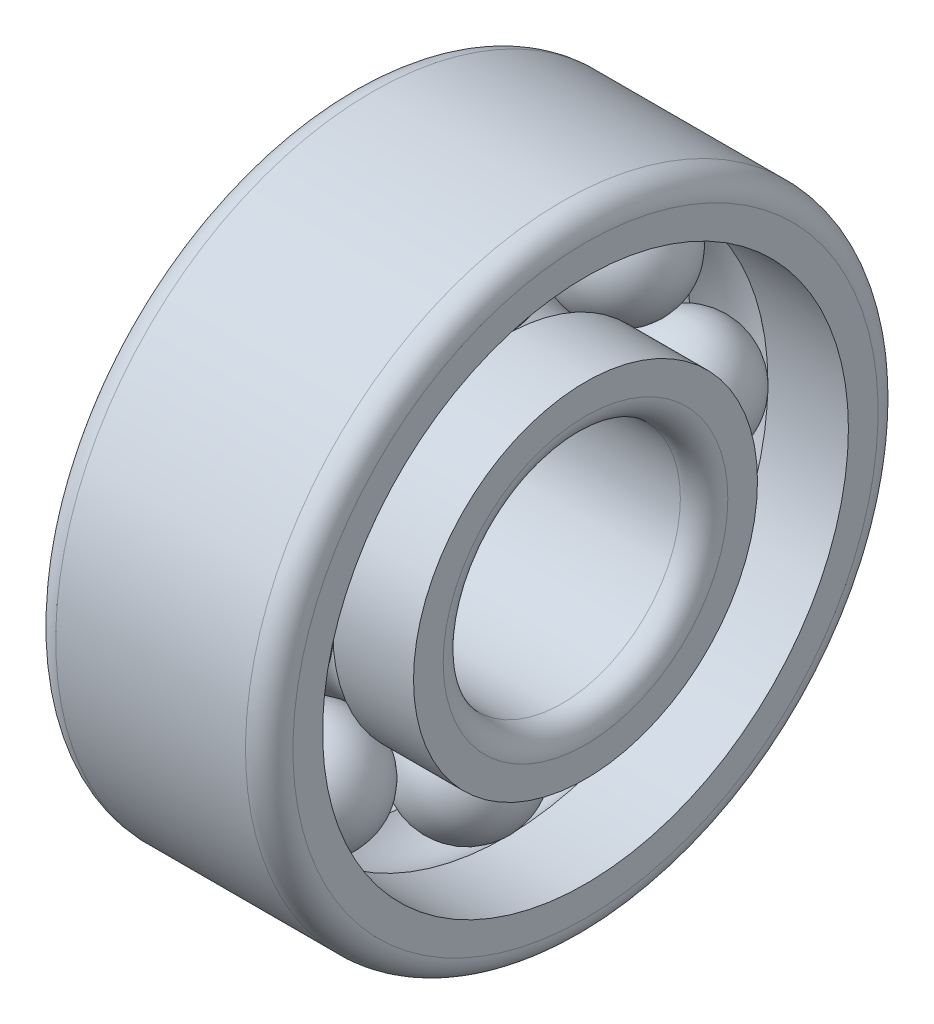
ISO-10303-21;
HEADER;
FILE_DESCRIPTION(('STEP AP214'),'2;1');
FILE_NAME('part.step','',(''),(''),'','','');
FILE_SCHEMA(('AUTOMOTIVE_DESIGN { 1 0 10303 214 1 1 1 1 }'));
ENDSEC;
DATA;
#1=APPLICATION_CONTEXT('core data for automotive mechanical design processes');
#2=APPLICATION_PROTOCOL_DEFINITION('international standard','automotive_design',2000,#1);
#3=PRODUCT_CONTEXT('',#1,'mechanical');
#4=PRODUCT('Part','Part','',(#3));
#5=PRODUCT_RELATED_PRODUCT_CATEGORY('part','',(#4));
#6=PRODUCT_DEFINITION_FORMATION('','',#4);
#7=PRODUCT_DEFINITION_CONTEXT('part definition',#1,'design');
#8=PRODUCT_DEFINITION('design','',#6,#7);
#9=PRODUCT_DEFINITION_SHAPE('','',#8);
#10=(LENGTH_UNIT() NAMED_UNIT(*) SI_UNIT(.MILLI.,.METRE.));
#11=(NAMED_UNIT(*) PLANE_ANGLE_UNIT() SI_UNIT($,.RADIAN.));
#12=(NAMED_UNIT(*) SI_UNIT($,.STERADIAN.) SOLID_ANGLE_UNIT());
#13=UNCERTAINTY_MEASURE_WITH_UNIT(LENGTH_MEASURE(1.E-05),#10,'distance_accuracy_value','');
#14=(GEOMETRIC_REPRESENTATION_CONTEXT(3) GLOBAL_UNCERTAINTY_ASSIGNED_CONTEXT((#13)) GLOBAL_UNIT_ASSIGNED_CONTEXT((#10,
#11,#12)) REPRESENTATION_CONTEXT('',''));
#15=CARTESIAN_POINT('',(0.,0.,0.));
#16=DIRECTION('',(0.,0.,1.));
#17=DIRECTION('',(1.,0.,0.));
#18=AXIS2_PLACEMENT_3D('',#15,#16,#17);
#19=CARTESIAN_POINT('',(0.,1.94454364826301,1.94454364826301));
#20=DIRECTION('',(1.,0.,0.));
#21=DIRECTION('',(0.,-0.707106781186548,0.707106781186548));
#22=AXIS2_PLACEMENT_3D('',#19,#20,#21);
#23=SPHERICAL_SURFACE('',#22,0.75);
#24=CARTESIAN_POINT('',(-0.749999999999993,1.94454364826301,1.94454364826301));
#25=VERTEX_POINT('',#24);
#26=VERTEX_LOOP('',#25);
#27=FACE_BOUND('',#26,.T.);
#28=CARTESIAN_POINT('',(0.750000000000007,1.94454364826301,1.94454364826301));
#29=VERTEX_POINT('',#28);
#30=VERTEX_LOOP('',#29);
#31=FACE_BOUND('',#30,.T.);
#32=ADVANCED_FACE('P0_F15',(#27,#31),#23,.T.);
#33=CLOSED_SHELL('',(#32));
#34=MANIFOLD_SOLID_BREP('P0_B1',#33);
#35=CARTESIAN_POINT('',(0.,0.,2.75));
#36=DIRECTION('',(1.,0.,0.));
#37=DIRECTION('',(0.,-1.,0.));
#38=AXIS2_PLACEMENT_3D('',#35,#36,#37);
#39=SPHERICAL_SURFACE('',#38,0.75);
#40=CARTESIAN_POINT('',(-0.749999999999993,0.,2.75));
#41=VERTEX_POINT('',#40);
#42=VERTEX_LOOP('',#41);
#43=FACE_BOUND('',#42,.T.);
#44=CARTESIAN_POINT('',(0.750000000000007,0.,2.75));
#45=VERTEX_POINT('',#44);
#46=VERTEX_LOOP('',#45);
#47=FACE_BOUND('',#46,.T.);
#48=ADVANCED_FACE('P1_F15',(#43,#47),#39,.T.);
#49=CLOSED_SHELL('',(#48));
#50=MANIFOLD_SOLID_BREP('P1_B1',#49);
#51=CARTESIAN_POINT('',(0.,-1.94454364826301,1.94454364826301));
#52=DIRECTION('',(1.,0.,0.));
#53=DIRECTION('',(0.,-0.707106781186548,-0.707106781186548));
#54=AXIS2_PLACEMENT_3D('',#51,#52,#53);
#55=SPHERICAL_SURFACE('',#54,0.75);
#56=CARTESIAN_POINT('',(-0.749999999999993,-1.94454364826301,1.94454364826301));
#57=VERTEX_POINT('',#56);
#58=VERTEX_LOOP('',#57);
#59=FACE_BOUND('',#58,.T.);
#60=CARTESIAN_POINT('',(0.750000000000007,-1.94454364826301,1.94454364826301));
#61=VERTEX_POINT('',#60);
#62=VERTEX_LOOP('',#61);
#63=FACE_BOUND('',#62,.T.);
#64=ADVANCED_FACE('P2_F15',(#59,#63),#55,.T.);
#65=CLOSED_SHELL('',(#64));
#66=MANIFOLD_SOLID_BREP('P2_B1',#65);
#67=CARTESIAN_POINT('',(0.,-2.75,0.));
#68=DIRECTION('',(1.,0.,0.));
#69=DIRECTION('',(0.,0.,-1.));
#70=AXIS2_PLACEMENT_3D('',#67,#68,#69);
#71=SPHERICAL_SURFACE('',#70,0.75);
#72=CARTESIAN_POINT('',(-0.749999999999993,-2.75,0.));
#73=VERTEX_POINT('',#72);
#74=VERTEX_LOOP('',#73);
#75=FACE_BOUND('',#74,.T.);
#76=CARTESIAN_POINT('',(0.750000000000007,-2.75,0.));
#77=VERTEX_POINT('',#76);
#78=VERTEX_LOOP('',#77);
#79=FACE_BOUND('',#78,.T.);
#80=ADVANCED_FACE('P3_F15',(#75,#79),#71,.T.);
#81=CLOSED_SHELL('',(#80));
#82=MANIFOLD_SOLID_BREP('P3_B1',#81);
#83=CARTESIAN_POINT('',(0.,-1.94454364826301,-1.94454364826301));
#84=DIRECTION('',(1.,0.,0.));
#85=DIRECTION('',(0.,0.707106781186548,-0.707106781186548));
#86=AXIS2_PLACEMENT_3D('',#83,#84,#85);
#87=SPHERICAL_SURFACE('',#86,0.75);
#88=CARTESIAN_POINT('',(-0.749999999999993,-1.94454364826301,-1.94454364826301));
#89=VERTEX_POINT('',#88);
#90=VERTEX_LOOP('',#89);
#91=FACE_BOUND('',#90,.T.);
#92=CARTESIAN_POINT('',(0.750000000000007,-1.94454364826301,-1.94454364826301));
#93=VERTEX_POINT('',#92);
#94=VERTEX_LOOP('',#93);
#95=FACE_BOUND('',#94,.T.);
#96=ADVANCED_FACE('P4_F15',(#91,#95),#87,.T.);
#97=CLOSED_SHELL('',(#96));
#98=MANIFOLD_SOLID_BREP('P4_B1',#97);
#99=CARTESIAN_POINT('',(0.,0.,-2.75));
#100=DIRECTION('',(1.,0.,0.));
#101=DIRECTION('',(0.,1.,0.));
#102=AXIS2_PLACEMENT_3D('',#99,#100,#101);
#103=SPHERICAL_SURFACE('',#102,0.75);
#104=CARTESIAN_POINT('',(-0.749999999999993,0.,-2.75));
#105=VERTEX_POINT('',#104);
#106=VERTEX_LOOP('',#105);
#107=FACE_BOUND('',#106,.T.);
#108=CARTESIAN_POINT('',(0.750000000000007,0.,-2.75));
#109=VERTEX_POINT('',#108);
#110=VERTEX_LOOP('',#109);
#111=FACE_BOUND('',#110,.T.);
#112=ADVANCED_FACE('P5_F15',(#107,#111),#103,.T.);
#113=CLOSED_SHELL('',(#112));
#114=MANIFOLD_SOLID_BREP('P5_B1',#113);
#115=CARTESIAN_POINT('',(0.,1.94454364826301,-1.94454364826301));
#116=DIRECTION('',(1.,0.,0.));
#117=DIRECTION('',(0.,0.707106781186548,0.707106781186548));
#118=AXIS2_PLACEMENT_3D('',#115,#116,#117);
#119=SPHERICAL_SURFACE('',#118,0.75);
#120=CARTESIAN_POINT('',(-0.749999999999993,1.94454364826301,-1.94454364826301));
#121=VERTEX_POINT('',#120);
#122=VERTEX_LOOP('',#121);
#123=FACE_BOUND('',#122,.T.);
#124=CARTESIAN_POINT('',(0.750000000000007,1.94454364826301,-1.94454364826301));
#125=VERTEX_POINT('',#124);
#126=VERTEX_LOOP('',#125);
#127=FACE_BOUND('',#126,.T.);
#128=ADVANCED_FACE('P6_F15',(#123,#127),#119,.T.);
#129=CLOSED_SHELL('',(#128));
#130=MANIFOLD_SOLID_BREP('P6_B1',#129);
#131=CARTESIAN_POINT('',(0.,2.75,0.));
#132=DIRECTION('',(1.,0.,0.));
#133=DIRECTION('',(0.,0.,1.));
#134=AXIS2_PLACEMENT_3D('',#131,#132,#133);
#135=SPHERICAL_SURFACE('',#134,0.75);
#136=CARTESIAN_POINT('',(-0.749999999999993,2.75,0.));
#137=VERTEX_POINT('',#136);
#138=VERTEX_LOOP('',#137);
#139=FACE_BOUND('',#138,.T.);
#140=CARTESIAN_POINT('',(0.750000000000007,2.75,0.));
#141=VERTEX_POINT('',#140);
#142=VERTEX_LOOP('',#141);
#143=FACE_BOUND('',#142,.T.);
#144=ADVANCED_FACE('P7_F15',(#139,#143),#135,.T.);
#145=CLOSED_SHELL('',(#144));
#146=MANIFOLD_SOLID_BREP('P7_B1',#145);
#147=CARTESIAN_POINT('',(0.,0.,0.));
#148=DIRECTION('',(1.,0.,0.));
#149=DIRECTION('',(0.,1.,0.));
#150=AXIS2_PLACEMENT_3D('',#147,#148,#149);
#151=TOROIDAL_SURFACE('',#150,2.75,0.75);
#152=CARTESIAN_POINT('',(-0.481534007106464,0.,0.));
#153=DIRECTION('',(1.,0.,0.));
#154=DIRECTION('',(0.,0.,-1.));
#155=AXIS2_PLACEMENT_3D('',#152,#153,#154);
#156=CIRCLE('',#155,3.32499999999999);
#157=CARTESIAN_POINT('',(-0.481534007106464,0.,-3.32499999999999));
#158=VERTEX_POINT('',#157);
#159=EDGE_CURVE('P8_E109',#158,#158,#156,.F.);
#160=ORIENTED_EDGE('',*,*,#159,.T.);
#161=EDGE_LOOP('',(#160));
#162=FACE_BOUND('',#161,.T.);
#163=CARTESIAN_POINT('',(0.481534007106464,0.,0.));
#164=DIRECTION('',(1.,0.,0.));
#165=DIRECTION('',(0.,0.,-1.));
#166=AXIS2_PLACEMENT_3D('',#163,#164,#165);
#167=CIRCLE('',#166,3.32499999999999);
#168=CARTESIAN_POINT('',(0.481534007106464,0.,-3.32499999999999));
#169=VERTEX_POINT('',#168);
#170=EDGE_CURVE('P8_E114',#169,#169,#167,.T.);
#171=ORIENTED_EDGE('',*,*,#170,.T.);
#172=EDGE_LOOP('',(#171));
#173=FACE_BOUND('',#172,.T.);
#174=ADVANCED_FACE('P8_F14',(#162,#173),#151,.F.);
#175=CARTESIAN_POINT('',(1.50000000000003,0.,0.));
#176=DIRECTION('',(1.,0.,0.));
#177=DIRECTION('',(0.,0.,-1.));
#178=AXIS2_PLACEMENT_3D('',#175,#176,#177);
#179=CYLINDRICAL_SURFACE('',#178,3.32499999999999);
#180=ORIENTED_EDGE('',*,*,#170,.F.);
#181=EDGE_LOOP('',(#180));
#182=FACE_BOUND('',#181,.T.);
#183=CARTESIAN_POINT('',(1.50000000000003,0.,0.));
#184=DIRECTION('',(1.,0.,0.));
#185=DIRECTION('',(0.,0.,-1.));
#186=AXIS2_PLACEMENT_3D('',#183,#184,#185);
#187=CIRCLE('',#186,3.32499999999999);
#188=CARTESIAN_POINT('',(1.50000000000003,0.,-3.32499999999999));
#189=VERTEX_POINT('',#188);
#190=EDGE_CURVE('P8_E18',#189,#189,#187,.F.);
#191=ORIENTED_EDGE('',*,*,#190,.F.);
#192=EDGE_LOOP('',(#191));
#193=FACE_BOUND('',#192,.T.);
#194=ADVANCED_FACE('P8_F85',(#182,#193),#179,.F.);
#195=CARTESIAN_POINT('',(1.50000000000003,0.,0.));
#196=DIRECTION('',(1.,0.,0.));
#197=DIRECTION('',(0.,0.,-1.));
#198=AXIS2_PLACEMENT_3D('',#195,#196,#197);
#199=CYLINDRICAL_SURFACE('',#198,3.32499999999999);
#200=CARTESIAN_POINT('',(-1.49999999999998,0.,0.));
#201=DIRECTION('',(1.,0.,0.));
#202=DIRECTION('',(0.,0.,-1.));
#203=AXIS2_PLACEMENT_3D('',#200,#201,#202);
#204=CIRCLE('',#203,3.32499999999999);
#205=CARTESIAN_POINT('',(-1.49999999999998,0.,-3.32499999999999));
#206=VERTEX_POINT('',#205);
#207=EDGE_CURVE('P8_E104',#206,#206,#204,.T.);
#208=ORIENTED_EDGE('',*,*,#207,.F.);
#209=EDGE_LOOP('',(#208));
#210=FACE_BOUND('',#209,.T.);
#211=ORIENTED_EDGE('',*,*,#159,.F.);
#212=EDGE_LOOP('',(#211));
#213=FACE_BOUND('',#212,.T.);
#214=ADVANCED_FACE('P8_F81',(#210,#213),#199,.F.);
#215=CARTESIAN_POINT('',(1.50000000000003,0.,0.));
#216=DIRECTION('',(1.,0.,0.));
#217=DIRECTION('',(0.,0.,-1.));
#218=AXIS2_PLACEMENT_3D('',#215,#216,#217);
#219=PLANE('',#218);
#220=ORIENTED_EDGE('',*,*,#190,.T.);
#221=EDGE_LOOP('',(#220));
#222=FACE_BOUND('',#221,.T.);
#223=CARTESIAN_POINT('',(1.50000000000003,0.,0.));
#224=DIRECTION('',(-1.,0.,0.));
#225=DIRECTION('',(0.,1.,0.));
#226=AXIS2_PLACEMENT_3D('',#223,#224,#225);
#227=CIRCLE('',#226,3.69999999999999);
#228=CARTESIAN_POINT('',(1.50000000000003,3.69999999999999,0.));
#229=VERTEX_POINT('',#228);
#230=EDGE_CURVE('P8_E65',#229,#229,#227,.T.);
#231=ORIENTED_EDGE('',*,*,#230,.F.);
#232=EDGE_LOOP('',(#231));
#233=FACE_BOUND('',#232,.T.);
#234=ADVANCED_FACE('P8_F71',(#222,#233),#219,.T.);
#235=CARTESIAN_POINT('',(-1.49999999999998,0.,0.));
#236=DIRECTION('',(-1.,0.,0.));
#237=DIRECTION('',(0.,0.,1.));
#238=AXIS2_PLACEMENT_3D('',#235,#236,#237);
#239=PLANE('',#238);
#240=ORIENTED_EDGE('',*,*,#207,.T.);
#241=EDGE_LOOP('',(#240));
#242=FACE_BOUND('',#241,.T.);
#243=CARTESIAN_POINT('',(-1.49999999999998,0.,0.));
#244=DIRECTION('',(1.,0.,0.));
#245=DIRECTION('',(0.,1.,0.));
#246=AXIS2_PLACEMENT_3D('',#243,#244,#245);
#247=CIRCLE('',#246,3.69999999999999);
#248=CARTESIAN_POINT('',(-1.49999999999998,3.69999999999999,0.));
#249=VERTEX_POINT('',#248);
#250=EDGE_CURVE('P8_E27',#249,#249,#247,.T.);
#251=ORIENTED_EDGE('',*,*,#250,.F.);
#252=EDGE_LOOP('',(#251));
#253=FACE_BOUND('',#252,.T.);
#254=ADVANCED_FACE('P8_F80',(#242,#253),#239,.T.);
#255=CARTESIAN_POINT('',(1.20000000000003,0.,0.));
#256=DIRECTION('',(1.,0.,0.));
#257=DIRECTION('',(0.,1.,0.));
#258=AXIS2_PLACEMENT_3D('',#255,#256,#257);
#259=TOROIDAL_SURFACE('',#258,3.69999999999999,0.3);
#260=CARTESIAN_POINT('',(1.20000000000003,0.,0.));
#261=DIRECTION('',(1.,0.,0.));
#262=DIRECTION('',(0.,0.,-1.));
#263=AXIS2_PLACEMENT_3D('',#260,#261,#262);
#264=CIRCLE('',#263,3.99999999999999);
#265=CARTESIAN_POINT('',(1.20000000000003,0.,-3.99999999999999));
#266=VERTEX_POINT('',#265);
#267=EDGE_CURVE('P8_E22',#266,#266,#264,.F.);
#268=ORIENTED_EDGE('',*,*,#267,.F.);
#269=EDGE_LOOP('',(#268));
#270=FACE_BOUND('',#269,.T.);
#271=ORIENTED_EDGE('',*,*,#230,.T.);
#272=EDGE_LOOP('',(#271));
#273=FACE_BOUND('',#272,.T.);
#274=ADVANCED_FACE('P8_F45',(#270,#273),#259,.T.);
#275=CARTESIAN_POINT('',(-1.19999999999998,0.,0.));
#276=DIRECTION('',(1.,0.,0.));
#277=DIRECTION('',(0.,1.,0.));
#278=AXIS2_PLACEMENT_3D('',#275,#276,#277);
#279=TOROIDAL_SURFACE('',#278,3.69999999999999,0.3);
#280=ORIENTED_EDGE('',*,*,#250,.T.);
#281=EDGE_LOOP('',(#280));
#282=FACE_BOUND('',#281,.T.);
#283=CARTESIAN_POINT('',(-1.19999999999998,0.,0.));
#284=DIRECTION('',(1.,0.,0.));
#285=DIRECTION('',(0.,0.,-1.));
#286=AXIS2_PLACEMENT_3D('',#283,#284,#285);
#287=CIRCLE('',#286,3.99999999999999);
#288=CARTESIAN_POINT('',(-1.19999999999998,0.,-3.99999999999999));
#289=VERTEX_POINT('',#288);
#290=EDGE_CURVE('P8_E10',#289,#289,#287,.T.);
#291=ORIENTED_EDGE('',*,*,#290,.F.);
#292=EDGE_LOOP('',(#291));
#293=FACE_BOUND('',#292,.T.);
#294=ADVANCED_FACE('P8_F39',(#282,#293),#279,.T.);
#295=CARTESIAN_POINT('',(-1.49999999999998,0.,0.));
#296=DIRECTION('',(1.,0.,0.));
#297=DIRECTION('',(0.,0.,-1.));
#298=AXIS2_PLACEMENT_3D('',#295,#296,#297);
#299=CYLINDRICAL_SURFACE('',#298,3.99999999999999);
#300=ORIENTED_EDGE('',*,*,#290,.T.);
#301=EDGE_LOOP('',(#300));
#302=FACE_BOUND('',#301,.T.);
#303=ORIENTED_EDGE('',*,*,#267,.T.);
#304=EDGE_LOOP('',(#303));
#305=FACE_BOUND('',#304,.T.);
#306=ADVANCED_FACE('P8_F44',(#302,#305),#299,.T.);
#307=CLOSED_SHELL('',(#174,#194,#214,#234,#254,#274,#294,#306));
#308=MANIFOLD_SOLID_BREP('P8_B1',#307);
#309=CARTESIAN_POINT('',(0.,0.,0.));
#310=DIRECTION('',(1.,0.,0.));
#311=DIRECTION('',(0.,1.,0.));
#312=AXIS2_PLACEMENT_3D('',#309,#310,#311);
#313=TOROIDAL_SURFACE('',#312,2.75,0.75);
#314=CARTESIAN_POINT('',(-0.481534007106447,0.,0.));
#315=DIRECTION('',(1.,0.,0.));
#316=DIRECTION('',(0.,0.,-1.));
#317=AXIS2_PLACEMENT_3D('',#314,#315,#316);
#318=CIRCLE('',#317,2.17499999999999);
#319=CARTESIAN_POINT('',(-0.481534007106447,0.,-2.17499999999999));
#320=VERTEX_POINT('',#319);
#321=EDGE_CURVE('P9_E109',#320,#320,#318,.F.);
#322=ORIENTED_EDGE('',*,*,#321,.F.);
#323=EDGE_LOOP('',(#322));
#324=FACE_BOUND('',#323,.T.);
#325=CARTESIAN_POINT('',(0.481534007106447,0.,0.));
#326=DIRECTION('',(1.,0.,0.));
#327=DIRECTION('',(0.,0.,-1.));
#328=AXIS2_PLACEMENT_3D('',#325,#326,#327);
#329=CIRCLE('',#328,2.17499999999999);
#330=CARTESIAN_POINT('',(0.481534007106447,0.,-2.17499999999999));
#331=VERTEX_POINT('',#330);
#332=EDGE_CURVE('P9_E114',#331,#331,#329,.T.);
#333=ORIENTED_EDGE('',*,*,#332,.F.);
#334=EDGE_LOOP('',(#333));
#335=FACE_BOUND('',#334,.T.);
#336=ADVANCED_FACE('P9_F14',(#324,#335),#313,.F.);
#337=CARTESIAN_POINT('',(-1.49999999999999,0.,0.));
#338=DIRECTION('',(1.,0.,0.));
#339=DIRECTION('',(0.,0.,-1.));
#340=AXIS2_PLACEMENT_3D('',#337,#338,#339);
#341=CYLINDRICAL_SURFACE('',#340,2.17499999999999);
#342=ORIENTED_EDGE('',*,*,#332,.T.);
#343=EDGE_LOOP('',(#342));
#344=FACE_BOUND('',#343,.T.);
#345=CARTESIAN_POINT('',(1.5,0.,0.));
#346=DIRECTION('',(1.,0.,0.));
#347=DIRECTION('',(0.,0.,-1.));
#348=AXIS2_PLACEMENT_3D('',#345,#346,#347);
#349=CIRCLE('',#348,2.17499999999999);
#350=CARTESIAN_POINT('',(1.5,0.,-2.17499999999999));
#351=VERTEX_POINT('',#350);
#352=EDGE_CURVE('P9_E18',#351,#351,#349,.T.);
#353=ORIENTED_EDGE('',*,*,#352,.F.);
#354=EDGE_LOOP('',(#353));
#355=FACE_BOUND('',#354,.T.);
#356=ADVANCED_FACE('P9_F84',(#344,#355),#341,.T.);
#357=CARTESIAN_POINT('',(-1.49999999999999,0.,0.));
#358=DIRECTION('',(1.,0.,0.));
#359=DIRECTION('',(0.,0.,-1.));
#360=AXIS2_PLACEMENT_3D('',#357,#358,#359);
#361=CYLINDRICAL_SURFACE('',#360,2.17499999999999);
#362=CARTESIAN_POINT('',(-1.49999999999999,0.,0.));
#363=DIRECTION('',(1.,0.,0.));
#364=DIRECTION('',(0.,0.,-1.));
#365=AXIS2_PLACEMENT_3D('',#362,#363,#364);
#366=CIRCLE('',#365,2.17499999999999);
#367=CARTESIAN_POINT('',(-1.49999999999999,0.,-2.17499999999999));
#368=VERTEX_POINT('',#367);
#369=EDGE_CURVE('P9_E104',#368,#368,#366,.F.);
#370=ORIENTED_EDGE('',*,*,#369,.F.);
#371=EDGE_LOOP('',(#370));
#372=FACE_BOUND('',#371,.T.);
#373=ORIENTED_EDGE('',*,*,#321,.T.);
#374=EDGE_LOOP('',(#373));
#375=FACE_BOUND('',#374,.T.);
#376=ADVANCED_FACE('P9_F81',(#372,#375),#361,.T.);
#377=CARTESIAN_POINT('',(1.50000000000001,0.,0.));
#378=DIRECTION('',(1.,0.,0.));
#379=DIRECTION('',(0.,0.,-1.));
#380=AXIS2_PLACEMENT_3D('',#377,#378,#379);
#381=PLANE('',#380);
#382=CARTESIAN_POINT('',(1.50000000000001,0.,0.));
#383=DIRECTION('',(1.,0.,0.));
#384=DIRECTION('',(0.,1.,0.));
#385=AXIS2_PLACEMENT_3D('',#382,#383,#384);
#386=CIRCLE('',#385,1.8);
#387=CARTESIAN_POINT('',(1.50000000000001,1.8,0.));
#388=VERTEX_POINT('',#387);
#389=EDGE_CURVE('P9_E65',#388,#388,#386,.T.);
#390=ORIENTED_EDGE('',*,*,#389,.F.);
#391=EDGE_LOOP('',(#390));
#392=FACE_BOUND('',#391,.T.);
#393=ORIENTED_EDGE('',*,*,#352,.T.);
#394=EDGE_LOOP('',(#393));
#395=FACE_BOUND('',#394,.T.);
#396=ADVANCED_FACE('P9_F71',(#392,#395),#381,.T.);
#397=CARTESIAN_POINT('',(-1.49999999999999,0.,0.));
#398=DIRECTION('',(-1.,0.,0.));
#399=DIRECTION('',(0.,0.,1.));
#400=AXIS2_PLACEMENT_3D('',#397,#398,#399);
#401=PLANE('',#400);
#402=CARTESIAN_POINT('',(-1.49999999999999,0.,0.));
#403=DIRECTION('',(-1.,0.,0.));
#404=DIRECTION('',(0.,1.,0.));
#405=AXIS2_PLACEMENT_3D('',#402,#403,#404);
#406=CIRCLE('',#405,1.8);
#407=CARTESIAN_POINT('',(-1.49999999999999,1.8,0.));
#408=VERTEX_POINT('',#407);
#409=EDGE_CURVE('P9_E27',#408,#408,#406,.T.);
#410=ORIENTED_EDGE('',*,*,#409,.F.);
#411=EDGE_LOOP('',(#410));
#412=FACE_BOUND('',#411,.T.);
#413=ORIENTED_EDGE('',*,*,#369,.T.);
#414=EDGE_LOOP('',(#413));
#415=FACE_BOUND('',#414,.T.);
#416=ADVANCED_FACE('P9_F80',(#412,#415),#401,.T.);
#417=CARTESIAN_POINT('',(1.20000000000001,0.,0.));
#418=DIRECTION('',(1.,0.,0.));
#419=DIRECTION('',(0.,1.,0.));
#420=AXIS2_PLACEMENT_3D('',#417,#418,#419);
#421=TOROIDAL_SURFACE('',#420,1.8,0.3);
#422=CARTESIAN_POINT('',(1.20000000000001,0.,0.));
#423=DIRECTION('',(1.,0.,0.));
#424=DIRECTION('',(0.,0.,-1.));
#425=AXIS2_PLACEMENT_3D('',#422,#423,#424);
#426=CIRCLE('',#425,1.5);
#427=CARTESIAN_POINT('',(1.20000000000001,0.,-1.5));
#428=VERTEX_POINT('',#427);
#429=EDGE_CURVE('P9_E22',#428,#428,#426,.F.);
#430=ORIENTED_EDGE('',*,*,#429,.T.);
#431=EDGE_LOOP('',(#430));
#432=FACE_BOUND('',#431,.T.);
#433=ORIENTED_EDGE('',*,*,#389,.T.);
#434=EDGE_LOOP('',(#433));
#435=FACE_BOUND('',#434,.T.);
#436=ADVANCED_FACE('P9_F45',(#432,#435),#421,.T.);
#437=CARTESIAN_POINT('',(-1.19999999999999,0.,0.));
#438=DIRECTION('',(1.,0.,0.));
#439=DIRECTION('',(0.,1.,0.));
#440=AXIS2_PLACEMENT_3D('',#437,#438,#439);
#441=TOROIDAL_SURFACE('',#440,1.8,0.3);
#442=ORIENTED_EDGE('',*,*,#409,.T.);
#443=EDGE_LOOP('',(#442));
#444=FACE_BOUND('',#443,.T.);
#445=CARTESIAN_POINT('',(-1.19999999999999,0.,0.));
#446=DIRECTION('',(1.,0.,0.));
#447=DIRECTION('',(0.,0.,-1.));
#448=AXIS2_PLACEMENT_3D('',#445,#446,#447);
#449=CIRCLE('',#448,1.5);
#450=CARTESIAN_POINT('',(-1.19999999999999,0.,-1.5));
#451=VERTEX_POINT('',#450);
#452=EDGE_CURVE('P9_E10',#451,#451,#449,.T.);
#453=ORIENTED_EDGE('',*,*,#452,.T.);
#454=EDGE_LOOP('',(#453));
#455=FACE_BOUND('',#454,.T.);
#456=ADVANCED_FACE('P9_F39',(#444,#455),#441,.T.);
#457=CARTESIAN_POINT('',(1.50000000000001,0.,0.));
#458=DIRECTION('',(1.,0.,0.));
#459=DIRECTION('',(0.,0.,-1.));
#460=AXIS2_PLACEMENT_3D('',#457,#458,#459);
#461=CYLINDRICAL_SURFACE('',#460,1.5);
#462=ORIENTED_EDGE('',*,*,#452,.F.);
#463=EDGE_LOOP('',(#462));
#464=FACE_BOUND('',#463,.T.);
#465=ORIENTED_EDGE('',*,*,#429,.F.);
#466=EDGE_LOOP('',(#465));
#467=FACE_BOUND('',#466,.T.);
#468=ADVANCED_FACE('P9_F44',(#464,#467),#461,.F.);
#469=CLOSED_SHELL('',(#336,#356,#376,#396,#416,#436,#456,#468));
#470=MANIFOLD_SOLID_BREP('P9_B1',#469);
#471=ADVANCED_BREP_SHAPE_REPRESENTATION('',(#18,#34,#50,#66,#82,#98,#114,#130,#146,#308,#470),#14);
#472=SHAPE_DEFINITION_REPRESENTATION(#9,#471);
ENDSEC;
END-ISO-10303-21;
